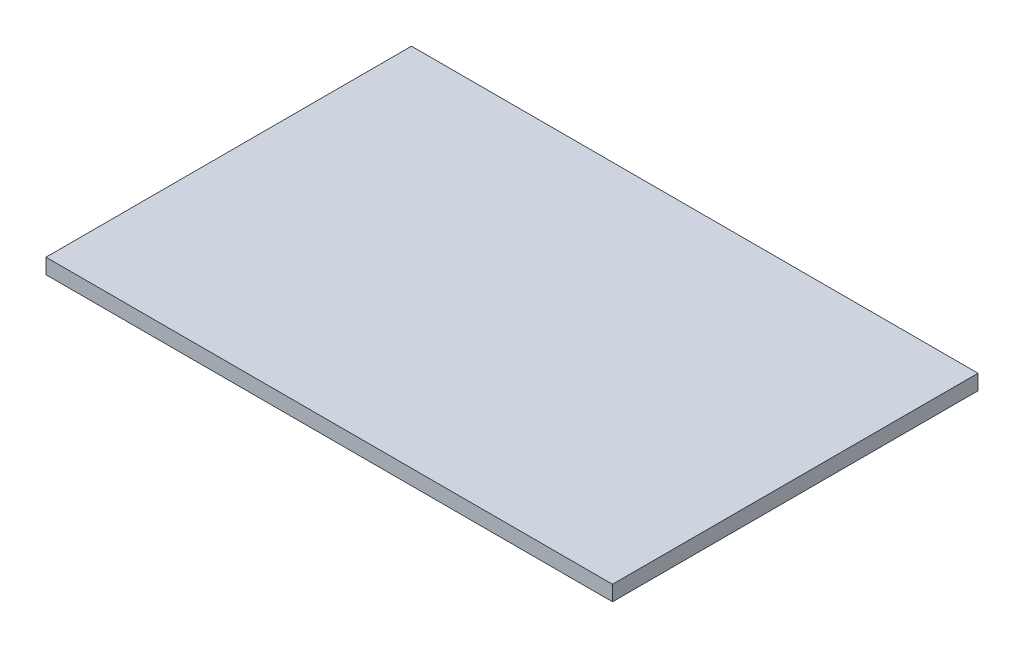
ISO-10303-21;
HEADER;
FILE_DESCRIPTION(('STEP AP214'),'2;1');
FILE_NAME('part.step','',(''),(''),'','','');
FILE_SCHEMA(('AUTOMOTIVE_DESIGN { 1 0 10303 214 1 1 1 1 }'));
ENDSEC;
DATA;
#1=APPLICATION_CONTEXT('core data for automotive mechanical design processes');
#2=APPLICATION_PROTOCOL_DEFINITION('international standard','automotive_design',2000,#1);
#3=PRODUCT_CONTEXT('',#1,'mechanical');
#4=PRODUCT('Part','Part','',(#3));
#5=PRODUCT_RELATED_PRODUCT_CATEGORY('part','',(#4));
#6=PRODUCT_DEFINITION_FORMATION('','',#4);
#7=PRODUCT_DEFINITION_CONTEXT('part definition',#1,'design');
#8=PRODUCT_DEFINITION('design','',#6,#7);
#9=PRODUCT_DEFINITION_SHAPE('','',#8);
#10=(LENGTH_UNIT() NAMED_UNIT(*) SI_UNIT(.MILLI.,.METRE.));
#11=(NAMED_UNIT(*) PLANE_ANGLE_UNIT() SI_UNIT($,.RADIAN.));
#12=(NAMED_UNIT(*) SI_UNIT($,.STERADIAN.) SOLID_ANGLE_UNIT());
#13=UNCERTAINTY_MEASURE_WITH_UNIT(LENGTH_MEASURE(1.E-05),#10,'distance_accuracy_value','');
#14=(GEOMETRIC_REPRESENTATION_CONTEXT(3) GLOBAL_UNCERTAINTY_ASSIGNED_CONTEXT((#13)) GLOBAL_UNIT_ASSIGNED_CONTEXT((#10,
#11,#12)) REPRESENTATION_CONTEXT('',''));
#15=CARTESIAN_POINT('',(0.,0.,0.));
#16=DIRECTION('',(0.,0.,1.));
#17=DIRECTION('',(1.,0.,0.));
#18=AXIS2_PLACEMENT_3D('',#15,#16,#17);
#19=CARTESIAN_POINT('',(0.,5.,0.));
#20=DIRECTION('',(1.,0.,0.));
#21=DIRECTION('',(0.,0.,-1.));
#22=AXIS2_PLACEMENT_3D('',#19,#20,#21);
#23=PLANE('',#22);
#24=DIRECTION('',(0.,0.,1.));
#25=VECTOR('',#24,1.);
#26=CARTESIAN_POINT('',(0.,0.,0.));
#27=LINE('',#26,#25);
#28=CARTESIAN_POINT('',(0.,0.,-120.));
#29=VERTEX_POINT('',#28);
#30=CARTESIAN_POINT('',(0.,0.,0.));
#31=VERTEX_POINT('',#30);
#32=EDGE_CURVE('E95',#29,#31,#27,.T.);
#33=ORIENTED_EDGE('',*,*,#32,.T.);
#34=DIRECTION('',(0.,-1.,0.));
#35=VECTOR('',#34,1.);
#36=CARTESIAN_POINT('',(0.,5.,0.));
#37=LINE('',#36,#35);
#38=CARTESIAN_POINT('',(0.,5.,0.));
#39=VERTEX_POINT('',#38);
#40=EDGE_CURVE('E11',#39,#31,#37,.T.);
#41=ORIENTED_EDGE('',*,*,#40,.F.);
#42=DIRECTION('',(0.,0.,1.));
#43=VECTOR('',#42,1.);
#44=CARTESIAN_POINT('',(0.,5.,0.));
#45=LINE('',#44,#43);
#46=CARTESIAN_POINT('',(0.,5.,-120.));
#47=VERTEX_POINT('',#46);
#48=EDGE_CURVE('E83',#47,#39,#45,.T.);
#49=ORIENTED_EDGE('',*,*,#48,.F.);
#50=DIRECTION('',(0.,-1.,0.));
#51=VECTOR('',#50,1.);
#52=CARTESIAN_POINT('',(0.,5.,-120.));
#53=LINE('',#52,#51);
#54=EDGE_CURVE('E91',#47,#29,#53,.T.);
#55=ORIENTED_EDGE('',*,*,#54,.T.);
#56=EDGE_LOOP('',(#33,#41,#49,#55));
#57=FACE_BOUND('',#56,.T.);
#58=ADVANCED_FACE('F32',(#57),#23,.F.);
#59=CARTESIAN_POINT('',(0.,5.,0.));
#60=DIRECTION('',(0.,0.,-1.));
#61=DIRECTION('',(-1.,0.,0.));
#62=AXIS2_PLACEMENT_3D('',#59,#60,#61);
#63=PLANE('',#62);
#64=DIRECTION('',(1.,0.,0.));
#65=VECTOR('',#64,1.);
#66=CARTESIAN_POINT('',(0.,0.,0.));
#67=LINE('',#66,#65);
#68=CARTESIAN_POINT('',(186.,0.,0.));
#69=VERTEX_POINT('',#68);
#70=EDGE_CURVE('E87',#31,#69,#67,.T.);
#71=ORIENTED_EDGE('',*,*,#70,.T.);
#72=DIRECTION('',(0.,-1.,0.));
#73=VECTOR('',#72,1.);
#74=CARTESIAN_POINT('',(186.,5.,0.));
#75=LINE('',#74,#73);
#76=CARTESIAN_POINT('',(186.,5.,0.));
#77=VERTEX_POINT('',#76);
#78=EDGE_CURVE('E40',#77,#69,#75,.T.);
#79=ORIENTED_EDGE('',*,*,#78,.F.);
#80=DIRECTION('',(1.,0.,0.));
#81=VECTOR('',#80,1.);
#82=CARTESIAN_POINT('',(0.,5.,0.));
#83=LINE('',#82,#81);
#84=EDGE_CURVE('E78',#39,#77,#83,.T.);
#85=ORIENTED_EDGE('',*,*,#84,.F.);
#86=ORIENTED_EDGE('',*,*,#40,.T.);
#87=EDGE_LOOP('',(#71,#79,#85,#86));
#88=FACE_BOUND('',#87,.T.);
#89=ADVANCED_FACE('F86',(#88),#63,.F.);
#90=CARTESIAN_POINT('',(186.,5.,0.));
#91=DIRECTION('',(-1.,0.,0.));
#92=DIRECTION('',(0.,0.,1.));
#93=AXIS2_PLACEMENT_3D('',#90,#91,#92);
#94=PLANE('',#93);
#95=DIRECTION('',(0.,0.,-1.));
#96=VECTOR('',#95,1.);
#97=CARTESIAN_POINT('',(186.,0.,0.));
#98=LINE('',#97,#96);
#99=CARTESIAN_POINT('',(186.,0.,-120.));
#100=VERTEX_POINT('',#99);
#101=EDGE_CURVE('E65',#69,#100,#98,.T.);
#102=ORIENTED_EDGE('',*,*,#101,.T.);
#103=DIRECTION('',(0.,-1.,0.));
#104=VECTOR('',#103,1.);
#105=CARTESIAN_POINT('',(186.,5.,-120.));
#106=LINE('',#105,#104);
#107=CARTESIAN_POINT('',(186.,5.,-120.));
#108=VERTEX_POINT('',#107);
#109=EDGE_CURVE('E88',#108,#100,#106,.T.);
#110=ORIENTED_EDGE('',*,*,#109,.F.);
#111=DIRECTION('',(0.,0.,-1.));
#112=VECTOR('',#111,1.);
#113=CARTESIAN_POINT('',(186.,5.,0.));
#114=LINE('',#113,#112);
#115=EDGE_CURVE('E81',#77,#108,#114,.T.);
#116=ORIENTED_EDGE('',*,*,#115,.F.);
#117=ORIENTED_EDGE('',*,*,#78,.T.);
#118=EDGE_LOOP('',(#102,#110,#116,#117));
#119=FACE_BOUND('',#118,.T.);
#120=ADVANCED_FACE('F89',(#119),#94,.F.);
#121=CARTESIAN_POINT('',(0.,5.,-120.));
#122=DIRECTION('',(0.,0.,1.));
#123=DIRECTION('',(1.,0.,0.));
#124=AXIS2_PLACEMENT_3D('',#121,#122,#123);
#125=PLANE('',#124);
#126=DIRECTION('',(-1.,0.,0.));
#127=VECTOR('',#126,1.);
#128=CARTESIAN_POINT('',(0.,0.,-120.));
#129=LINE('',#128,#127);
#130=EDGE_CURVE('E71',#100,#29,#129,.T.);
#131=ORIENTED_EDGE('',*,*,#130,.T.);
#132=ORIENTED_EDGE('',*,*,#54,.F.);
#133=DIRECTION('',(-1.,0.,0.));
#134=VECTOR('',#133,1.);
#135=CARTESIAN_POINT('',(0.,5.,-120.));
#136=LINE('',#135,#134);
#137=EDGE_CURVE('E48',#108,#47,#136,.T.);
#138=ORIENTED_EDGE('',*,*,#137,.F.);
#139=ORIENTED_EDGE('',*,*,#109,.T.);
#140=EDGE_LOOP('',(#131,#132,#138,#139));
#141=FACE_BOUND('',#140,.T.);
#142=ADVANCED_FACE('F102',(#141),#125,.F.);
#143=CARTESIAN_POINT('',(0.,5.,0.));
#144=DIRECTION('',(0.,-1.,0.));
#145=DIRECTION('',(0.,0.,-1.));
#146=AXIS2_PLACEMENT_3D('',#143,#144,#145);
#147=PLANE('',#146);
#148=ORIENTED_EDGE('',*,*,#48,.T.);
#149=ORIENTED_EDGE('',*,*,#84,.T.);
#150=ORIENTED_EDGE('',*,*,#115,.T.);
#151=ORIENTED_EDGE('',*,*,#137,.T.);
#152=EDGE_LOOP('',(#148,#149,#150,#151));
#153=FACE_BOUND('',#152,.T.);
#154=ADVANCED_FACE('F79',(#153),#147,.F.);
#155=CARTESIAN_POINT('',(0.,0.,0.));
#156=DIRECTION('',(0.,-1.,0.));
#157=DIRECTION('',(0.,0.,-1.));
#158=AXIS2_PLACEMENT_3D('',#155,#156,#157);
#159=PLANE('',#158);
#160=ORIENTED_EDGE('',*,*,#32,.F.);
#161=ORIENTED_EDGE('',*,*,#130,.F.);
#162=ORIENTED_EDGE('',*,*,#101,.F.);
#163=ORIENTED_EDGE('',*,*,#70,.F.);
#164=EDGE_LOOP('',(#160,#161,#162,#163));
#165=FACE_BOUND('',#164,.T.);
#166=ADVANCED_FACE('F105',(#165),#159,.T.);
#167=CLOSED_SHELL('',(#58,#89,#120,#142,#154,#166));
#168=MANIFOLD_SOLID_BREP('B2',#167);
#169=ADVANCED_BREP_SHAPE_REPRESENTATION('',(#18,#168),#14);
#170=SHAPE_DEFINITION_REPRESENTATION(#9,#169);
ENDSEC;
END-ISO-10303-21;
